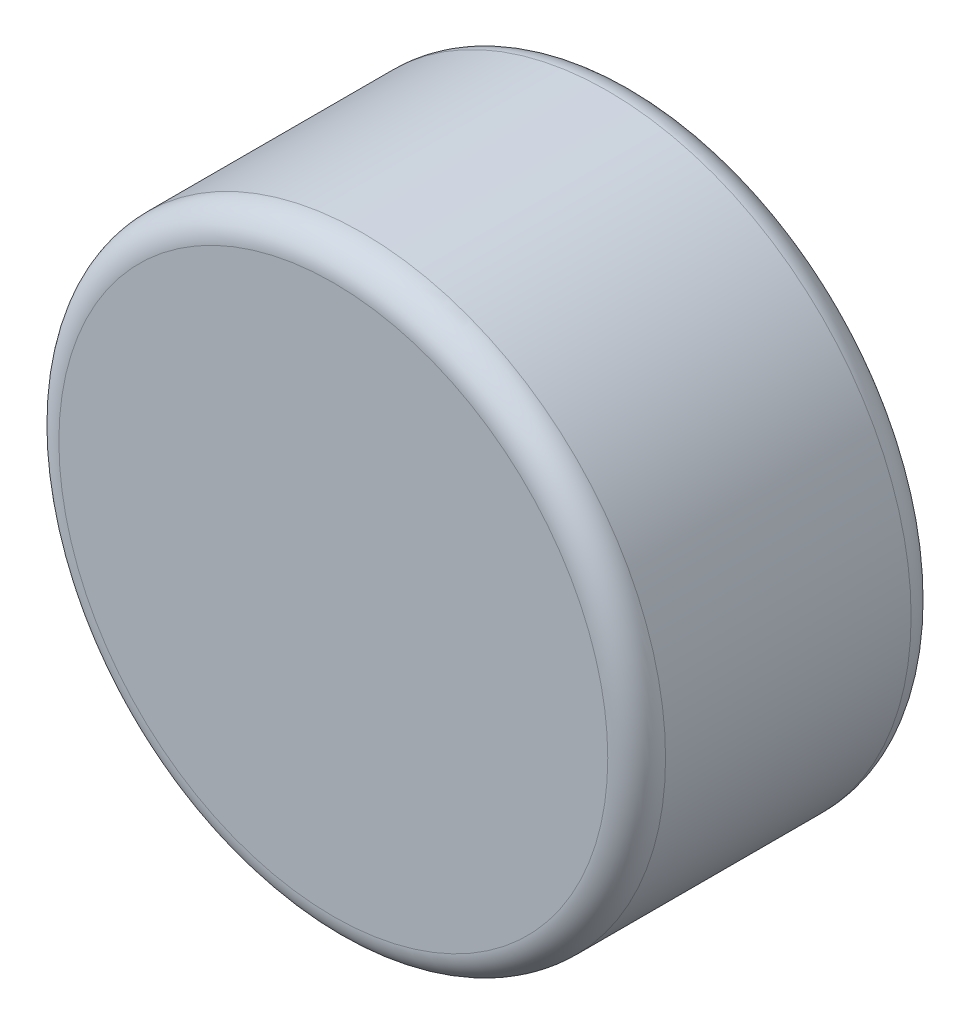
ISO-10303-21;
HEADER;
FILE_DESCRIPTION(('STEP AP214'),'2;1');
FILE_NAME('part.step','',(''),(''),'','','');
FILE_SCHEMA(('AUTOMOTIVE_DESIGN { 1 0 10303 214 1 1 1 1 }'));
ENDSEC;
DATA;
#1=APPLICATION_CONTEXT('core data for automotive mechanical design processes');
#2=APPLICATION_PROTOCOL_DEFINITION('international standard','automotive_design',2000,#1);
#3=PRODUCT_CONTEXT('',#1,'mechanical');
#4=PRODUCT('Part','Part','',(#3));
#5=PRODUCT_RELATED_PRODUCT_CATEGORY('part','',(#4));
#6=PRODUCT_DEFINITION_FORMATION('','',#4);
#7=PRODUCT_DEFINITION_CONTEXT('part definition',#1,'design');
#8=PRODUCT_DEFINITION('design','',#6,#7);
#9=PRODUCT_DEFINITION_SHAPE('','',#8);
#10=(LENGTH_UNIT() NAMED_UNIT(*) SI_UNIT(.MILLI.,.METRE.));
#11=(NAMED_UNIT(*) PLANE_ANGLE_UNIT() SI_UNIT($,.RADIAN.));
#12=(NAMED_UNIT(*) SI_UNIT($,.STERADIAN.) SOLID_ANGLE_UNIT());
#13=UNCERTAINTY_MEASURE_WITH_UNIT(LENGTH_MEASURE(1.E-05),#10,'distance_accuracy_value','');
#14=(GEOMETRIC_REPRESENTATION_CONTEXT(3) GLOBAL_UNCERTAINTY_ASSIGNED_CONTEXT((#13)) GLOBAL_UNIT_ASSIGNED_CONTEXT((#10,
#11,#12)) REPRESENTATION_CONTEXT('',''));
#15=CARTESIAN_POINT('',(0.,0.,0.));
#16=DIRECTION('',(0.,0.,1.));
#17=DIRECTION('',(1.,0.,0.));
#18=AXIS2_PLACEMENT_3D('',#15,#16,#17);
#19=CARTESIAN_POINT('',(0.,0.,3.15));
#20=DIRECTION('',(0.,0.,-1.));
#21=DIRECTION('',(-1.,0.,0.));
#22=AXIS2_PLACEMENT_3D('',#19,#20,#21);
#23=CYLINDRICAL_SURFACE('',#22,3.15);
#24=CARTESIAN_POINT('',(0.,0.,0.3));
#25=DIRECTION('',(0.,0.,1.));
#26=DIRECTION('',(1.,0.,0.));
#27=AXIS2_PLACEMENT_3D('',#24,#25,#26);
#28=CIRCLE('',#27,3.15);
#29=CARTESIAN_POINT('',(3.15,0.,0.3));
#30=VERTEX_POINT('',#29);
#31=EDGE_CURVE('E52',#30,#30,#28,.T.);
#32=ORIENTED_EDGE('',*,*,#31,.T.);
#33=EDGE_LOOP('',(#32));
#34=FACE_BOUND('',#33,.T.);
#35=CARTESIAN_POINT('',(0.,0.,2.85));
#36=DIRECTION('',(0.,0.,1.));
#37=DIRECTION('',(1.,0.,0.));
#38=AXIS2_PLACEMENT_3D('',#35,#36,#37);
#39=CIRCLE('',#38,3.15);
#40=CARTESIAN_POINT('',(3.15,0.,2.85));
#41=VERTEX_POINT('',#40);
#42=EDGE_CURVE('E57',#41,#41,#39,.F.);
#43=ORIENTED_EDGE('',*,*,#42,.T.);
#44=EDGE_LOOP('',(#43));
#45=FACE_BOUND('',#44,.T.);
#46=ADVANCED_FACE('F39',(#34,#45),#23,.T.);
#47=CARTESIAN_POINT('',(0.,0.,3.15));
#48=DIRECTION('',(0.,0.,1.));
#49=DIRECTION('',(1.,0.,0.));
#50=AXIS2_PLACEMENT_3D('',#47,#48,#49);
#51=PLANE('',#50);
#52=CARTESIAN_POINT('',(0.,0.,3.15));
#53=DIRECTION('',(0.,0.,1.));
#54=DIRECTION('',(1.,0.,0.));
#55=AXIS2_PLACEMENT_3D('',#52,#53,#54);
#56=CIRCLE('',#55,2.85);
#57=CARTESIAN_POINT('',(2.85,0.,3.15));
#58=VERTEX_POINT('',#57);
#59=EDGE_CURVE('E10',#58,#58,#56,.T.);
#60=ORIENTED_EDGE('',*,*,#59,.T.);
#61=EDGE_LOOP('',(#60));
#62=FACE_BOUND('',#61,.T.);
#63=ADVANCED_FACE('F74',(#62),#51,.T.);
#64=CARTESIAN_POINT('',(0.,0.,0.));
#65=DIRECTION('',(0.,0.,1.));
#66=DIRECTION('',(1.,0.,0.));
#67=AXIS2_PLACEMENT_3D('',#64,#65,#66);
#68=PLANE('',#67);
#69=CARTESIAN_POINT('',(0.,0.,0.));
#70=DIRECTION('',(0.,0.,1.));
#71=DIRECTION('',(1.,0.,0.));
#72=AXIS2_PLACEMENT_3D('',#69,#70,#71);
#73=CIRCLE('',#72,2.85);
#74=CARTESIAN_POINT('',(2.85,0.,0.));
#75=VERTEX_POINT('',#74);
#76=EDGE_CURVE('E47',#75,#75,#73,.F.);
#77=ORIENTED_EDGE('',*,*,#76,.T.);
#78=EDGE_LOOP('',(#77));
#79=FACE_BOUND('',#78,.T.);
#80=ADVANCED_FACE('F71',(#79),#68,.F.);
#81=CARTESIAN_POINT('',(0.,0.,0.3));
#82=DIRECTION('',(0.,0.,1.));
#83=DIRECTION('',(1.,0.,0.));
#84=AXIS2_PLACEMENT_3D('',#81,#82,#83);
#85=TOROIDAL_SURFACE('',#84,2.85,0.3);
#86=ORIENTED_EDGE('',*,*,#76,.F.);
#87=EDGE_LOOP('',(#86));
#88=FACE_BOUND('',#87,.T.);
#89=ORIENTED_EDGE('',*,*,#31,.F.);
#90=EDGE_LOOP('',(#89));
#91=FACE_BOUND('',#90,.T.);
#92=ADVANCED_FACE('F67',(#88,#91),#85,.T.);
#93=CARTESIAN_POINT('',(0.,0.,2.85));
#94=DIRECTION('',(0.,0.,1.));
#95=DIRECTION('',(1.,0.,0.));
#96=AXIS2_PLACEMENT_3D('',#93,#94,#95);
#97=TOROIDAL_SURFACE('',#96,2.85,0.3);
#98=ORIENTED_EDGE('',*,*,#42,.F.);
#99=EDGE_LOOP('',(#98));
#100=FACE_BOUND('',#99,.T.);
#101=ORIENTED_EDGE('',*,*,#59,.F.);
#102=EDGE_LOOP('',(#101));
#103=FACE_BOUND('',#102,.T.);
#104=ADVANCED_FACE('F41',(#100,#103),#97,.T.);
#105=CLOSED_SHELL('',(#46,#63,#80,#92,#104));
#106=MANIFOLD_SOLID_BREP('B2',#105);
#107=ADVANCED_BREP_SHAPE_REPRESENTATION('',(#18,#106),#14);
#108=SHAPE_DEFINITION_REPRESENTATION(#9,#107);
ENDSEC;
END-ISO-10303-21;
